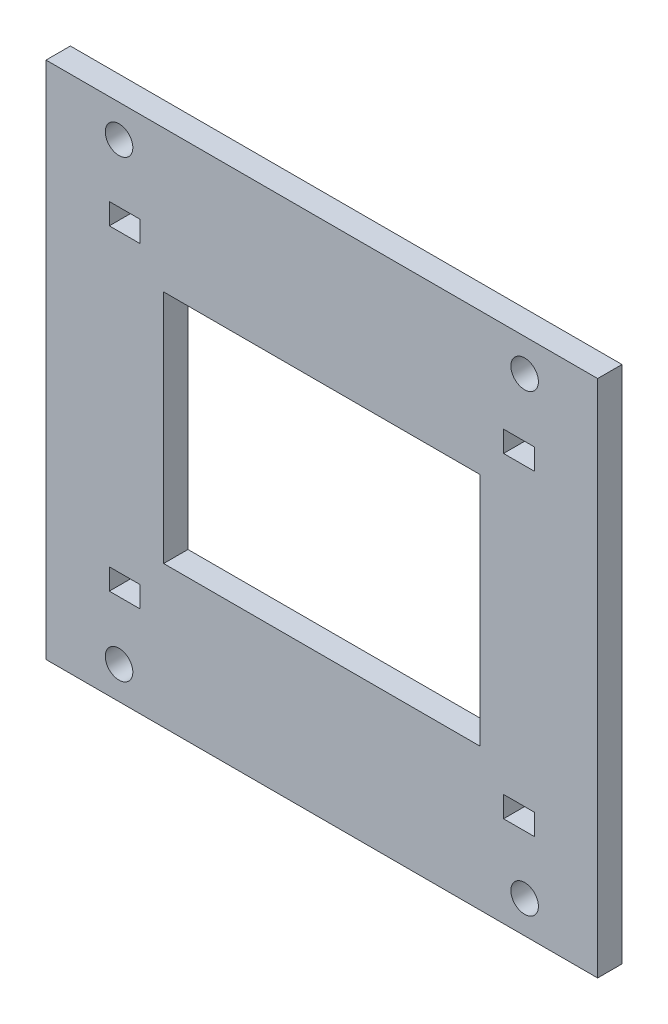
ISO-10303-21;
HEADER;
FILE_DESCRIPTION(('STEP AP214'),'2;1');
FILE_NAME('part.step','',(''),(''),'','','');
FILE_SCHEMA(('AUTOMOTIVE_DESIGN { 1 0 10303 214 1 1 1 1 }'));
ENDSEC;
DATA;
#1=APPLICATION_CONTEXT('core data for automotive mechanical design processes');
#2=APPLICATION_PROTOCOL_DEFINITION('international standard','automotive_design',2000,#1);
#3=PRODUCT_CONTEXT('',#1,'mechanical');
#4=PRODUCT('Part','Part','',(#3));
#5=PRODUCT_RELATED_PRODUCT_CATEGORY('part','',(#4));
#6=PRODUCT_DEFINITION_FORMATION('','',#4);
#7=PRODUCT_DEFINITION_CONTEXT('part definition',#1,'design');
#8=PRODUCT_DEFINITION('design','',#6,#7);
#9=PRODUCT_DEFINITION_SHAPE('','',#8);
#10=(LENGTH_UNIT() NAMED_UNIT(*) SI_UNIT(.MILLI.,.METRE.));
#11=(NAMED_UNIT(*) PLANE_ANGLE_UNIT() SI_UNIT($,.RADIAN.));
#12=(NAMED_UNIT(*) SI_UNIT($,.STERADIAN.) SOLID_ANGLE_UNIT());
#13=UNCERTAINTY_MEASURE_WITH_UNIT(LENGTH_MEASURE(1.E-05),#10,'distance_accuracy_value','');
#14=(GEOMETRIC_REPRESENTATION_CONTEXT(3) GLOBAL_UNCERTAINTY_ASSIGNED_CONTEXT((#13)) GLOBAL_UNIT_ASSIGNED_CONTEXT((#10,
#11,#12)) REPRESENTATION_CONTEXT('',''));
#15=CARTESIAN_POINT('',(0.,0.,0.));
#16=DIRECTION('',(0.,0.,1.));
#17=DIRECTION('',(1.,0.,0.));
#18=AXIS2_PLACEMENT_3D('',#15,#16,#17);
#19=CARTESIAN_POINT('',(0.,0.,3.));
#20=DIRECTION('',(0.,0.,1.));
#21=DIRECTION('',(1.,0.,0.));
#22=AXIS2_PLACEMENT_3D('',#19,#20,#21);
#23=PLANE('',#22);
#24=CARTESIAN_POINT('',(-25.,28.,3.));
#25=DIRECTION('',(0.,0.,1.));
#26=DIRECTION('',(1.,0.,0.));
#27=AXIS2_PLACEMENT_3D('',#24,#25,#26);
#28=CIRCLE('',#27,1.7);
#29=CARTESIAN_POINT('',(-23.3,28.,3.));
#30=VERTEX_POINT('',#29);
#31=EDGE_CURVE('E379',#30,#30,#28,.F.);
#32=ORIENTED_EDGE('',*,*,#31,.T.);
#33=EDGE_LOOP('',(#32));
#34=FACE_BOUND('',#33,.T.);
#35=CARTESIAN_POINT('',(25.,-28.,3.));
#36=DIRECTION('',(0.,0.,1.));
#37=DIRECTION('',(1.,0.,0.));
#38=AXIS2_PLACEMENT_3D('',#35,#36,#37);
#39=CIRCLE('',#38,1.7);
#40=CARTESIAN_POINT('',(26.7,-28.,3.));
#41=VERTEX_POINT('',#40);
#42=EDGE_CURVE('E369',#41,#41,#39,.F.);
#43=ORIENTED_EDGE('',*,*,#42,.T.);
#44=EDGE_LOOP('',(#43));
#45=FACE_BOUND('',#44,.T.);
#46=CARTESIAN_POINT('',(25.,28.,3.));
#47=DIRECTION('',(0.,0.,1.));
#48=DIRECTION('',(1.,0.,0.));
#49=AXIS2_PLACEMENT_3D('',#46,#47,#48);
#50=CIRCLE('',#49,1.7);
#51=CARTESIAN_POINT('',(26.7,28.,3.));
#52=VERTEX_POINT('',#51);
#53=EDGE_CURVE('E368',#52,#52,#50,.F.);
#54=ORIENTED_EDGE('',*,*,#53,.T.);
#55=EDGE_LOOP('',(#54));
#56=FACE_BOUND('',#55,.T.);
#57=CARTESIAN_POINT('',(-25.,-28.,3.));
#58=DIRECTION('',(0.,0.,1.));
#59=DIRECTION('',(1.,0.,0.));
#60=AXIS2_PLACEMENT_3D('',#57,#58,#59);
#61=CIRCLE('',#60,1.7);
#62=CARTESIAN_POINT('',(-23.3,-28.,3.));
#63=VERTEX_POINT('',#62);
#64=EDGE_CURVE('E361',#63,#63,#61,.F.);
#65=ORIENTED_EDGE('',*,*,#64,.T.);
#66=EDGE_LOOP('',(#65));
#67=FACE_BOUND('',#66,.T.);
#68=DIRECTION('',(0.,-1.,0.));
#69=VECTOR('',#68,1.);
#70=CARTESIAN_POINT('',(-34.,32.,3.));
#71=LINE('',#70,#69);
#72=CARTESIAN_POINT('',(-34.,32.,3.));
#73=VERTEX_POINT('',#72);
#74=CARTESIAN_POINT('',(-34.,-32.,3.));
#75=VERTEX_POINT('',#74);
#76=EDGE_CURVE('E295',#73,#75,#71,.T.);
#77=ORIENTED_EDGE('',*,*,#76,.T.);
#78=DIRECTION('',(1.,0.,0.));
#79=VECTOR('',#78,1.);
#80=CARTESIAN_POINT('',(-34.,-32.,3.));
#81=LINE('',#80,#79);
#82=CARTESIAN_POINT('',(34.,-32.,3.));
#83=VERTEX_POINT('',#82);
#84=EDGE_CURVE('E293',#75,#83,#81,.T.);
#85=ORIENTED_EDGE('',*,*,#84,.T.);
#86=DIRECTION('',(0.,1.,0.));
#87=VECTOR('',#86,1.);
#88=CARTESIAN_POINT('',(34.,-32.,3.));
#89=LINE('',#88,#87);
#90=CARTESIAN_POINT('',(34.,32.,3.));
#91=VERTEX_POINT('',#90);
#92=EDGE_CURVE('E297',#83,#91,#89,.T.);
#93=ORIENTED_EDGE('',*,*,#92,.T.);
#94=DIRECTION('',(-1.,0.,0.));
#95=VECTOR('',#94,1.);
#96=CARTESIAN_POINT('',(34.,32.,3.));
#97=LINE('',#96,#95);
#98=EDGE_CURVE('E296',#91,#73,#97,.T.);
#99=ORIENTED_EDGE('',*,*,#98,.T.);
#100=EDGE_LOOP('',(#77,#85,#93,#99));
#101=FACE_BOUND('',#100,.T.);
#102=DIRECTION('',(-1.,0.,0.));
#103=VECTOR('',#102,1.);
#104=CARTESIAN_POINT('',(0.,-14.5,3.));
#105=LINE('',#104,#103);
#106=CARTESIAN_POINT('',(19.5,-14.5,3.));
#107=VERTEX_POINT('',#106);
#108=CARTESIAN_POINT('',(-19.5,-14.5,3.));
#109=VERTEX_POINT('',#108);
#110=EDGE_CURVE('E281',#107,#109,#105,.T.);
#111=ORIENTED_EDGE('',*,*,#110,.T.);
#112=DIRECTION('',(0.,1.,0.));
#113=VECTOR('',#112,1.);
#114=CARTESIAN_POINT('',(-19.5,0.,3.));
#115=LINE('',#114,#113);
#116=CARTESIAN_POINT('',(-19.5,14.5,3.));
#117=VERTEX_POINT('',#116);
#118=EDGE_CURVE('E286',#109,#117,#115,.T.);
#119=ORIENTED_EDGE('',*,*,#118,.T.);
#120=DIRECTION('',(1.,0.,0.));
#121=VECTOR('',#120,1.);
#122=CARTESIAN_POINT('',(0.,14.5,3.));
#123=LINE('',#122,#121);
#124=CARTESIAN_POINT('',(19.5,14.5,3.));
#125=VERTEX_POINT('',#124);
#126=EDGE_CURVE('E276',#117,#125,#123,.T.);
#127=ORIENTED_EDGE('',*,*,#126,.T.);
#128=DIRECTION('',(0.,-1.,0.));
#129=VECTOR('',#128,1.);
#130=CARTESIAN_POINT('',(19.5,0.,3.));
#131=LINE('',#130,#129);
#132=EDGE_CURVE('E284',#125,#107,#131,.T.);
#133=ORIENTED_EDGE('',*,*,#132,.T.);
#134=EDGE_LOOP('',(#111,#119,#127,#133));
#135=FACE_BOUND('',#134,.T.);
#136=DIRECTION('',(-1.,0.,0.));
#137=VECTOR('',#136,1.);
#138=CARTESIAN_POINT('',(0.,-20.8,3.));
#139=LINE('',#138,#137);
#140=CARTESIAN_POINT('',(-22.4,-20.8,3.));
#141=VERTEX_POINT('',#140);
#142=CARTESIAN_POINT('',(-26.2,-20.8,3.));
#143=VERTEX_POINT('',#142);
#144=EDGE_CURVE('E229',#141,#143,#139,.T.);
#145=ORIENTED_EDGE('',*,*,#144,.T.);
#146=DIRECTION('',(0.,1.,0.));
#147=VECTOR('',#146,1.);
#148=CARTESIAN_POINT('',(-26.2,0.,3.));
#149=LINE('',#148,#147);
#150=CARTESIAN_POINT('',(-26.2,-18.2,3.));
#151=VERTEX_POINT('',#150);
#152=EDGE_CURVE('E217',#143,#151,#149,.T.);
#153=ORIENTED_EDGE('',*,*,#152,.T.);
#154=DIRECTION('',(1.,0.,0.));
#155=VECTOR('',#154,1.);
#156=CARTESIAN_POINT('',(0.,-18.2,3.));
#157=LINE('',#156,#155);
#158=CARTESIAN_POINT('',(-22.4,-18.2,3.));
#159=VERTEX_POINT('',#158);
#160=EDGE_CURVE('E203',#151,#159,#157,.T.);
#161=ORIENTED_EDGE('',*,*,#160,.T.);
#162=DIRECTION('',(0.,-1.,0.));
#163=VECTOR('',#162,1.);
#164=CARTESIAN_POINT('',(-22.4,0.,3.));
#165=LINE('',#164,#163);
#166=EDGE_CURVE('E215',#159,#141,#165,.T.);
#167=ORIENTED_EDGE('',*,*,#166,.T.);
#168=EDGE_LOOP('',(#145,#153,#161,#167));
#169=FACE_BOUND('',#168,.T.);
#170=DIRECTION('',(-1.,0.,0.));
#171=VECTOR('',#170,1.);
#172=CARTESIAN_POINT('',(0.,18.2,3.));
#173=LINE('',#172,#171);
#174=CARTESIAN_POINT('',(26.2,18.2,3.));
#175=VERTEX_POINT('',#174);
#176=CARTESIAN_POINT('',(22.4,18.2,3.));
#177=VERTEX_POINT('',#176);
#178=EDGE_CURVE('E236',#175,#177,#173,.T.);
#179=ORIENTED_EDGE('',*,*,#178,.T.);
#180=DIRECTION('',(0.,1.,0.));
#181=VECTOR('',#180,1.);
#182=CARTESIAN_POINT('',(22.4,0.,3.));
#183=LINE('',#182,#181);
#184=CARTESIAN_POINT('',(22.4,20.8,3.));
#185=VERTEX_POINT('',#184);
#186=EDGE_CURVE('E243',#177,#185,#183,.T.);
#187=ORIENTED_EDGE('',*,*,#186,.T.);
#188=DIRECTION('',(1.,0.,0.));
#189=VECTOR('',#188,1.);
#190=CARTESIAN_POINT('',(0.,20.8,3.));
#191=LINE('',#190,#189);
#192=CARTESIAN_POINT('',(26.2,20.8,3.));
#193=VERTEX_POINT('',#192);
#194=EDGE_CURVE('E227',#185,#193,#191,.T.);
#195=ORIENTED_EDGE('',*,*,#194,.T.);
#196=DIRECTION('',(0.,-1.,0.));
#197=VECTOR('',#196,1.);
#198=CARTESIAN_POINT('',(26.2,0.,3.));
#199=LINE('',#198,#197);
#200=EDGE_CURVE('E233',#193,#175,#199,.T.);
#201=ORIENTED_EDGE('',*,*,#200,.T.);
#202=EDGE_LOOP('',(#179,#187,#195,#201));
#203=FACE_BOUND('',#202,.T.);
#204=DIRECTION('',(-1.,0.,0.));
#205=VECTOR('',#204,1.);
#206=CARTESIAN_POINT('',(0.,-20.8,3.));
#207=LINE('',#206,#205);
#208=CARTESIAN_POINT('',(26.2,-20.8,3.));
#209=VERTEX_POINT('',#208);
#210=CARTESIAN_POINT('',(22.4,-20.8,3.));
#211=VERTEX_POINT('',#210);
#212=EDGE_CURVE('E249',#209,#211,#207,.T.);
#213=ORIENTED_EDGE('',*,*,#212,.T.);
#214=DIRECTION('',(0.,1.,0.));
#215=VECTOR('',#214,1.);
#216=CARTESIAN_POINT('',(22.4,0.,3.));
#217=LINE('',#216,#215);
#218=CARTESIAN_POINT('',(22.4,-18.2,3.));
#219=VERTEX_POINT('',#218);
#220=EDGE_CURVE('E251',#211,#219,#217,.T.);
#221=ORIENTED_EDGE('',*,*,#220,.T.);
#222=DIRECTION('',(1.,0.,0.));
#223=VECTOR('',#222,1.);
#224=CARTESIAN_POINT('',(0.,-18.2,3.));
#225=LINE('',#224,#223);
#226=CARTESIAN_POINT('',(26.2,-18.2,3.));
#227=VERTEX_POINT('',#226);
#228=EDGE_CURVE('E245',#219,#227,#225,.T.);
#229=ORIENTED_EDGE('',*,*,#228,.T.);
#230=DIRECTION('',(0.,-1.,0.));
#231=VECTOR('',#230,1.);
#232=CARTESIAN_POINT('',(26.2,0.,3.));
#233=LINE('',#232,#231);
#234=EDGE_CURVE('E250',#227,#209,#233,.T.);
#235=ORIENTED_EDGE('',*,*,#234,.T.);
#236=EDGE_LOOP('',(#213,#221,#229,#235));
#237=FACE_BOUND('',#236,.T.);
#238=DIRECTION('',(-1.,0.,0.));
#239=VECTOR('',#238,1.);
#240=CARTESIAN_POINT('',(0.,18.2,3.));
#241=LINE('',#240,#239);
#242=CARTESIAN_POINT('',(-22.4,18.2,3.));
#243=VERTEX_POINT('',#242);
#244=CARTESIAN_POINT('',(-26.2,18.2,3.));
#245=VERTEX_POINT('',#244);
#246=EDGE_CURVE('E265',#243,#245,#241,.T.);
#247=ORIENTED_EDGE('',*,*,#246,.T.);
#248=DIRECTION('',(0.,1.,0.));
#249=VECTOR('',#248,1.);
#250=CARTESIAN_POINT('',(-26.2,0.,3.));
#251=LINE('',#250,#249);
#252=CARTESIAN_POINT('',(-26.2,20.8,3.));
#253=VERTEX_POINT('',#252);
#254=EDGE_CURVE('E264',#245,#253,#251,.T.);
#255=ORIENTED_EDGE('',*,*,#254,.T.);
#256=DIRECTION('',(1.,0.,0.));
#257=VECTOR('',#256,1.);
#258=CARTESIAN_POINT('',(0.,20.8,3.));
#259=LINE('',#258,#257);
#260=CARTESIAN_POINT('',(-22.4,20.8,3.));
#261=VERTEX_POINT('',#260);
#262=EDGE_CURVE('E258',#253,#261,#259,.T.);
#263=ORIENTED_EDGE('',*,*,#262,.T.);
#264=DIRECTION('',(0.,-1.,0.));
#265=VECTOR('',#264,1.);
#266=CARTESIAN_POINT('',(-22.4,0.,3.));
#267=LINE('',#266,#265);
#268=EDGE_CURVE('E259',#261,#243,#267,.T.);
#269=ORIENTED_EDGE('',*,*,#268,.T.);
#270=EDGE_LOOP('',(#247,#255,#263,#269));
#271=FACE_BOUND('',#270,.T.);
#272=ADVANCED_FACE('F39',(#34,#45,#56,#67,#101,#135,#169,#203,#237,#271),#23,.T.);
#273=CARTESIAN_POINT('',(0.,0.,0.));
#274=DIRECTION('',(0.,0.,1.));
#275=DIRECTION('',(1.,0.,0.));
#276=AXIS2_PLACEMENT_3D('',#273,#274,#275);
#277=PLANE('',#276);
#278=CARTESIAN_POINT('',(-25.,28.,0.));
#279=DIRECTION('',(0.,0.,1.));
#280=DIRECTION('',(1.,0.,0.));
#281=AXIS2_PLACEMENT_3D('',#278,#279,#280);
#282=CIRCLE('',#281,1.7);
#283=CARTESIAN_POINT('',(-23.3,28.,0.));
#284=VERTEX_POINT('',#283);
#285=EDGE_CURVE('E43',#284,#284,#282,.F.);
#286=ORIENTED_EDGE('',*,*,#285,.F.);
#287=EDGE_LOOP('',(#286));
#288=FACE_BOUND('',#287,.T.);
#289=CARTESIAN_POINT('',(25.,-28.,0.));
#290=DIRECTION('',(0.,0.,1.));
#291=DIRECTION('',(1.,0.,0.));
#292=AXIS2_PLACEMENT_3D('',#289,#290,#291);
#293=CIRCLE('',#292,1.7);
#294=CARTESIAN_POINT('',(26.7,-28.,0.));
#295=VERTEX_POINT('',#294);
#296=EDGE_CURVE('E370',#295,#295,#293,.F.);
#297=ORIENTED_EDGE('',*,*,#296,.F.);
#298=EDGE_LOOP('',(#297));
#299=FACE_BOUND('',#298,.T.);
#300=CARTESIAN_POINT('',(25.,28.,0.));
#301=DIRECTION('',(0.,0.,1.));
#302=DIRECTION('',(1.,0.,0.));
#303=AXIS2_PLACEMENT_3D('',#300,#301,#302);
#304=CIRCLE('',#303,1.7);
#305=CARTESIAN_POINT('',(26.7,28.,0.));
#306=VERTEX_POINT('',#305);
#307=EDGE_CURVE('E365',#306,#306,#304,.F.);
#308=ORIENTED_EDGE('',*,*,#307,.F.);
#309=EDGE_LOOP('',(#308));
#310=FACE_BOUND('',#309,.T.);
#311=CARTESIAN_POINT('',(-25.,-28.,0.));
#312=DIRECTION('',(0.,0.,1.));
#313=DIRECTION('',(1.,0.,0.));
#314=AXIS2_PLACEMENT_3D('',#311,#312,#313);
#315=CIRCLE('',#314,1.7);
#316=CARTESIAN_POINT('',(-23.3,-28.,0.));
#317=VERTEX_POINT('',#316);
#318=EDGE_CURVE('E359',#317,#317,#315,.F.);
#319=ORIENTED_EDGE('',*,*,#318,.F.);
#320=EDGE_LOOP('',(#319));
#321=FACE_BOUND('',#320,.T.);
#322=DIRECTION('',(0.,1.,0.));
#323=VECTOR('',#322,1.);
#324=CARTESIAN_POINT('',(22.4,0.,0.));
#325=LINE('',#324,#323);
#326=CARTESIAN_POINT('',(22.4,-20.8,0.));
#327=VERTEX_POINT('',#326);
#328=CARTESIAN_POINT('',(22.4,-18.2,0.));
#329=VERTEX_POINT('',#328);
#330=EDGE_CURVE('E354',#327,#329,#325,.T.);
#331=ORIENTED_EDGE('',*,*,#330,.F.);
#332=DIRECTION('',(-1.,0.,0.));
#333=VECTOR('',#332,1.);
#334=CARTESIAN_POINT('',(0.,-20.8,0.));
#335=LINE('',#334,#333);
#336=CARTESIAN_POINT('',(26.2,-20.8,0.));
#337=VERTEX_POINT('',#336);
#338=EDGE_CURVE('E348',#337,#327,#335,.T.);
#339=ORIENTED_EDGE('',*,*,#338,.F.);
#340=DIRECTION('',(0.,-1.,0.));
#341=VECTOR('',#340,1.);
#342=CARTESIAN_POINT('',(26.2,0.,0.));
#343=LINE('',#342,#341);
#344=CARTESIAN_POINT('',(26.2,-18.2,0.));
#345=VERTEX_POINT('',#344);
#346=EDGE_CURVE('E346',#345,#337,#343,.T.);
#347=ORIENTED_EDGE('',*,*,#346,.F.);
#348=DIRECTION('',(1.,0.,0.));
#349=VECTOR('',#348,1.);
#350=CARTESIAN_POINT('',(0.,-18.2,0.));
#351=LINE('',#350,#349);
#352=EDGE_CURVE('E347',#329,#345,#351,.T.);
#353=ORIENTED_EDGE('',*,*,#352,.F.);
#354=EDGE_LOOP('',(#331,#339,#347,#353));
#355=FACE_BOUND('',#354,.T.);
#356=DIRECTION('',(0.,1.,0.));
#357=VECTOR('',#356,1.);
#358=CARTESIAN_POINT('',(-26.2,0.,0.));
#359=LINE('',#358,#357);
#360=CARTESIAN_POINT('',(-26.2,-20.8,0.));
#361=VERTEX_POINT('',#360);
#362=CARTESIAN_POINT('',(-26.2,-18.2,0.));
#363=VERTEX_POINT('',#362);
#364=EDGE_CURVE('E222',#361,#363,#359,.T.);
#365=ORIENTED_EDGE('',*,*,#364,.F.);
#366=DIRECTION('',(-1.,0.,0.));
#367=VECTOR('',#366,1.);
#368=CARTESIAN_POINT('',(0.,-20.8,0.));
#369=LINE('',#368,#367);
#370=CARTESIAN_POINT('',(-22.4,-20.8,0.));
#371=VERTEX_POINT('',#370);
#372=EDGE_CURVE('E331',#371,#361,#369,.T.);
#373=ORIENTED_EDGE('',*,*,#372,.F.);
#374=DIRECTION('',(0.,-1.,0.));
#375=VECTOR('',#374,1.);
#376=CARTESIAN_POINT('',(-22.4,0.,0.));
#377=LINE('',#376,#375);
#378=CARTESIAN_POINT('',(-22.4,-18.2,0.));
#379=VERTEX_POINT('',#378);
#380=EDGE_CURVE('E335',#379,#371,#377,.T.);
#381=ORIENTED_EDGE('',*,*,#380,.F.);
#382=DIRECTION('',(1.,0.,0.));
#383=VECTOR('',#382,1.);
#384=CARTESIAN_POINT('',(0.,-18.2,0.));
#385=LINE('',#384,#383);
#386=EDGE_CURVE('E329',#363,#379,#385,.T.);
#387=ORIENTED_EDGE('',*,*,#386,.F.);
#388=EDGE_LOOP('',(#365,#373,#381,#387));
#389=FACE_BOUND('',#388,.T.);
#390=DIRECTION('',(0.,-1.,0.));
#391=VECTOR('',#390,1.);
#392=CARTESIAN_POINT('',(-34.,32.,0.));
#393=LINE('',#392,#391);
#394=CARTESIAN_POINT('',(-34.,32.,0.));
#395=VERTEX_POINT('',#394);
#396=CARTESIAN_POINT('',(-34.,-32.,0.));
#397=VERTEX_POINT('',#396);
#398=EDGE_CURVE('E292',#395,#397,#393,.T.);
#399=ORIENTED_EDGE('',*,*,#398,.F.);
#400=DIRECTION('',(-1.,0.,0.));
#401=VECTOR('',#400,1.);
#402=CARTESIAN_POINT('',(34.,32.,0.));
#403=LINE('',#402,#401);
#404=CARTESIAN_POINT('',(34.,32.,0.));
#405=VERTEX_POINT('',#404);
#406=EDGE_CURVE('E298',#405,#395,#403,.T.);
#407=ORIENTED_EDGE('',*,*,#406,.F.);
#408=DIRECTION('',(0.,1.,0.));
#409=VECTOR('',#408,1.);
#410=CARTESIAN_POINT('',(34.,-32.,0.));
#411=LINE('',#410,#409);
#412=CARTESIAN_POINT('',(34.,-32.,0.));
#413=VERTEX_POINT('',#412);
#414=EDGE_CURVE('E307',#413,#405,#411,.T.);
#415=ORIENTED_EDGE('',*,*,#414,.F.);
#416=DIRECTION('',(1.,0.,0.));
#417=VECTOR('',#416,1.);
#418=CARTESIAN_POINT('',(-34.,-32.,0.));
#419=LINE('',#418,#417);
#420=EDGE_CURVE('E304',#397,#413,#419,.T.);
#421=ORIENTED_EDGE('',*,*,#420,.F.);
#422=EDGE_LOOP('',(#399,#407,#415,#421));
#423=FACE_BOUND('',#422,.T.);
#424=DIRECTION('',(0.,1.,0.));
#425=VECTOR('',#424,1.);
#426=CARTESIAN_POINT('',(-19.5,0.,0.));
#427=LINE('',#426,#425);
#428=CARTESIAN_POINT('',(-19.5,-14.5,0.));
#429=VERTEX_POINT('',#428);
#430=CARTESIAN_POINT('',(-19.5,14.5,0.));
#431=VERTEX_POINT('',#430);
#432=EDGE_CURVE('E330',#429,#431,#427,.T.);
#433=ORIENTED_EDGE('',*,*,#432,.F.);
#434=DIRECTION('',(-1.,0.,0.));
#435=VECTOR('',#434,1.);
#436=CARTESIAN_POINT('',(0.,-14.5,0.));
#437=LINE('',#436,#435);
#438=CARTESIAN_POINT('',(19.5,-14.5,0.));
#439=VERTEX_POINT('',#438);
#440=EDGE_CURVE('E324',#439,#429,#437,.T.);
#441=ORIENTED_EDGE('',*,*,#440,.F.);
#442=DIRECTION('',(0.,-1.,0.));
#443=VECTOR('',#442,1.);
#444=CARTESIAN_POINT('',(19.5,0.,0.));
#445=LINE('',#444,#443);
#446=CARTESIAN_POINT('',(19.5,14.5,0.));
#447=VERTEX_POINT('',#446);
#448=EDGE_CURVE('E323',#447,#439,#445,.T.);
#449=ORIENTED_EDGE('',*,*,#448,.F.);
#450=DIRECTION('',(1.,0.,0.));
#451=VECTOR('',#450,1.);
#452=CARTESIAN_POINT('',(0.,14.5,0.));
#453=LINE('',#452,#451);
#454=EDGE_CURVE('E321',#431,#447,#453,.T.);
#455=ORIENTED_EDGE('',*,*,#454,.F.);
#456=EDGE_LOOP('',(#433,#441,#449,#455));
#457=FACE_BOUND('',#456,.T.);
#458=DIRECTION('',(0.,1.,0.));
#459=VECTOR('',#458,1.);
#460=CARTESIAN_POINT('',(22.4,0.,0.));
#461=LINE('',#460,#459);
#462=CARTESIAN_POINT('',(22.4,18.2,0.));
#463=VERTEX_POINT('',#462);
#464=CARTESIAN_POINT('',(22.4,20.8,0.));
#465=VERTEX_POINT('',#464);
#466=EDGE_CURVE('E341',#463,#465,#461,.T.);
#467=ORIENTED_EDGE('',*,*,#466,.F.);
#468=DIRECTION('',(-1.,0.,0.));
#469=VECTOR('',#468,1.);
#470=CARTESIAN_POINT('',(0.,18.2,0.));
#471=LINE('',#470,#469);
#472=CARTESIAN_POINT('',(26.2,18.2,0.));
#473=VERTEX_POINT('',#472);
#474=EDGE_CURVE('E343',#473,#463,#471,.T.);
#475=ORIENTED_EDGE('',*,*,#474,.F.);
#476=DIRECTION('',(0.,-1.,0.));
#477=VECTOR('',#476,1.);
#478=CARTESIAN_POINT('',(26.2,0.,0.));
#479=LINE('',#478,#477);
#480=CARTESIAN_POINT('',(26.2,20.8,0.));
#481=VERTEX_POINT('',#480);
#482=EDGE_CURVE('E340',#481,#473,#479,.T.);
#483=ORIENTED_EDGE('',*,*,#482,.F.);
#484=DIRECTION('',(1.,0.,0.));
#485=VECTOR('',#484,1.);
#486=CARTESIAN_POINT('',(0.,20.8,0.));
#487=LINE('',#486,#485);
#488=EDGE_CURVE('E339',#465,#481,#487,.T.);
#489=ORIENTED_EDGE('',*,*,#488,.F.);
#490=EDGE_LOOP('',(#467,#475,#483,#489));
#491=FACE_BOUND('',#490,.T.);
#492=DIRECTION('',(0.,1.,0.));
#493=VECTOR('',#492,1.);
#494=CARTESIAN_POINT('',(-26.2,0.,0.));
#495=LINE('',#494,#493);
#496=CARTESIAN_POINT('',(-26.2,18.2,0.));
#497=VERTEX_POINT('',#496);
#498=CARTESIAN_POINT('',(-26.2,20.8,0.));
#499=VERTEX_POINT('',#498);
#500=EDGE_CURVE('E11',#497,#499,#495,.T.);
#501=ORIENTED_EDGE('',*,*,#500,.F.);
#502=DIRECTION('',(-1.,0.,0.));
#503=VECTOR('',#502,1.);
#504=CARTESIAN_POINT('',(0.,18.2,0.));
#505=LINE('',#504,#503);
#506=CARTESIAN_POINT('',(-22.4,18.2,0.));
#507=VERTEX_POINT('',#506);
#508=EDGE_CURVE('E48',#507,#497,#505,.T.);
#509=ORIENTED_EDGE('',*,*,#508,.F.);
#510=DIRECTION('',(0.,-1.,0.));
#511=VECTOR('',#510,1.);
#512=CARTESIAN_POINT('',(-22.4,0.,0.));
#513=LINE('',#512,#511);
#514=CARTESIAN_POINT('',(-22.4,20.8,0.));
#515=VERTEX_POINT('',#514);
#516=EDGE_CURVE('E360',#515,#507,#513,.T.);
#517=ORIENTED_EDGE('',*,*,#516,.F.);
#518=DIRECTION('',(1.,0.,0.));
#519=VECTOR('',#518,1.);
#520=CARTESIAN_POINT('',(0.,20.8,0.));
#521=LINE('',#520,#519);
#522=EDGE_CURVE('E351',#499,#515,#521,.T.);
#523=ORIENTED_EDGE('',*,*,#522,.F.);
#524=EDGE_LOOP('',(#501,#509,#517,#523));
#525=FACE_BOUND('',#524,.T.);
#526=ADVANCED_FACE('F421',(#288,#299,#310,#321,#355,#389,#423,#457,#491,#525),#277,.F.);
#527=CARTESIAN_POINT('',(-34.,32.,3.));
#528=DIRECTION('',(1.,0.,0.));
#529=DIRECTION('',(0.,0.,-1.));
#530=AXIS2_PLACEMENT_3D('',#527,#528,#529);
#531=PLANE('',#530);
#532=ORIENTED_EDGE('',*,*,#398,.T.);
#533=DIRECTION('',(0.,0.,-1.));
#534=VECTOR('',#533,1.);
#535=CARTESIAN_POINT('',(-34.,-32.,3.));
#536=LINE('',#535,#534);
#537=EDGE_CURVE('E318',#75,#397,#536,.T.);
#538=ORIENTED_EDGE('',*,*,#537,.F.);
#539=ORIENTED_EDGE('',*,*,#76,.F.);
#540=DIRECTION('',(0.,0.,-1.));
#541=VECTOR('',#540,1.);
#542=CARTESIAN_POINT('',(-34.,32.,3.));
#543=LINE('',#542,#541);
#544=EDGE_CURVE('E305',#73,#395,#543,.T.);
#545=ORIENTED_EDGE('',*,*,#544,.T.);
#546=EDGE_LOOP('',(#532,#538,#539,#545));
#547=FACE_BOUND('',#546,.T.);
#548=ADVANCED_FACE('F41',(#547),#531,.F.);
#549=CARTESIAN_POINT('',(-34.,-32.,3.));
#550=DIRECTION('',(0.,1.,0.));
#551=DIRECTION('',(0.,0.,1.));
#552=AXIS2_PLACEMENT_3D('',#549,#550,#551);
#553=PLANE('',#552);
#554=ORIENTED_EDGE('',*,*,#420,.T.);
#555=DIRECTION('',(0.,0.,-1.));
#556=VECTOR('',#555,1.);
#557=CARTESIAN_POINT('',(34.,-32.,3.));
#558=LINE('',#557,#556);
#559=EDGE_CURVE('E312',#83,#413,#558,.T.);
#560=ORIENTED_EDGE('',*,*,#559,.F.);
#561=ORIENTED_EDGE('',*,*,#84,.F.);
#562=ORIENTED_EDGE('',*,*,#537,.T.);
#563=EDGE_LOOP('',(#554,#560,#561,#562));
#564=FACE_BOUND('',#563,.T.);
#565=ADVANCED_FACE('F479',(#564),#553,.F.);
#566=CARTESIAN_POINT('',(34.,-32.,3.));
#567=DIRECTION('',(-1.,0.,0.));
#568=DIRECTION('',(0.,0.,1.));
#569=AXIS2_PLACEMENT_3D('',#566,#567,#568);
#570=PLANE('',#569);
#571=ORIENTED_EDGE('',*,*,#414,.T.);
#572=DIRECTION('',(0.,0.,-1.));
#573=VECTOR('',#572,1.);
#574=CARTESIAN_POINT('',(34.,32.,3.));
#575=LINE('',#574,#573);
#576=EDGE_CURVE('E315',#91,#405,#575,.T.);
#577=ORIENTED_EDGE('',*,*,#576,.F.);
#578=ORIENTED_EDGE('',*,*,#92,.F.);
#579=ORIENTED_EDGE('',*,*,#559,.T.);
#580=EDGE_LOOP('',(#571,#577,#578,#579));
#581=FACE_BOUND('',#580,.T.);
#582=ADVANCED_FACE('F478',(#581),#570,.F.);
#583=CARTESIAN_POINT('',(34.,32.,3.));
#584=DIRECTION('',(0.,-1.,0.));
#585=DIRECTION('',(0.,0.,-1.));
#586=AXIS2_PLACEMENT_3D('',#583,#584,#585);
#587=PLANE('',#586);
#588=ORIENTED_EDGE('',*,*,#406,.T.);
#589=ORIENTED_EDGE('',*,*,#544,.F.);
#590=ORIENTED_EDGE('',*,*,#98,.F.);
#591=ORIENTED_EDGE('',*,*,#576,.T.);
#592=EDGE_LOOP('',(#588,#589,#590,#591));
#593=FACE_BOUND('',#592,.T.);
#594=ADVANCED_FACE('F471',(#593),#587,.F.);
#595=CARTESIAN_POINT('',(-19.5,14.5,3.1));
#596=DIRECTION('',(1.,0.,0.));
#597=DIRECTION('',(0.,0.,-1.));
#598=AXIS2_PLACEMENT_3D('',#595,#596,#597);
#599=PLANE('',#598);
#600=DIRECTION('',(0.,0.,-1.));
#601=VECTOR('',#600,1.);
#602=CARTESIAN_POINT('',(-19.5,-14.5,3.1));
#603=LINE('',#602,#601);
#604=EDGE_CURVE('E277',#109,#429,#603,.T.);
#605=ORIENTED_EDGE('',*,*,#604,.T.);
#606=ORIENTED_EDGE('',*,*,#432,.T.);
#607=DIRECTION('',(0.,0.,-1.));
#608=VECTOR('',#607,1.);
#609=CARTESIAN_POINT('',(-19.5,14.5,3.1));
#610=LINE('',#609,#608);
#611=EDGE_CURVE('E268',#117,#431,#610,.T.);
#612=ORIENTED_EDGE('',*,*,#611,.F.);
#613=ORIENTED_EDGE('',*,*,#118,.F.);
#614=EDGE_LOOP('',(#605,#606,#612,#613));
#615=FACE_BOUND('',#614,.T.);
#616=ADVANCED_FACE('F469',(#615),#599,.T.);
#617=CARTESIAN_POINT('',(-19.5,-14.5,3.1));
#618=DIRECTION('',(0.,1.,0.));
#619=DIRECTION('',(0.,0.,1.));
#620=AXIS2_PLACEMENT_3D('',#617,#618,#619);
#621=PLANE('',#620);
#622=DIRECTION('',(0.,0.,-1.));
#623=VECTOR('',#622,1.);
#624=CARTESIAN_POINT('',(19.5,-14.5,3.1));
#625=LINE('',#624,#623);
#626=EDGE_CURVE('E272',#107,#439,#625,.T.);
#627=ORIENTED_EDGE('',*,*,#626,.T.);
#628=ORIENTED_EDGE('',*,*,#440,.T.);
#629=ORIENTED_EDGE('',*,*,#604,.F.);
#630=ORIENTED_EDGE('',*,*,#110,.F.);
#631=EDGE_LOOP('',(#627,#628,#629,#630));
#632=FACE_BOUND('',#631,.T.);
#633=ADVANCED_FACE('F503',(#632),#621,.T.);
#634=CARTESIAN_POINT('',(19.5,-14.5,3.1));
#635=DIRECTION('',(-1.,0.,0.));
#636=DIRECTION('',(0.,0.,1.));
#637=AXIS2_PLACEMENT_3D('',#634,#635,#636);
#638=PLANE('',#637);
#639=DIRECTION('',(0.,0.,-1.));
#640=VECTOR('',#639,1.);
#641=CARTESIAN_POINT('',(19.5,14.5,3.1));
#642=LINE('',#641,#640);
#643=EDGE_CURVE('E269',#125,#447,#642,.T.);
#644=ORIENTED_EDGE('',*,*,#643,.T.);
#645=ORIENTED_EDGE('',*,*,#448,.T.);
#646=ORIENTED_EDGE('',*,*,#626,.F.);
#647=ORIENTED_EDGE('',*,*,#132,.F.);
#648=EDGE_LOOP('',(#644,#645,#646,#647));
#649=FACE_BOUND('',#648,.T.);
#650=ADVANCED_FACE('F502',(#649),#638,.T.);
#651=CARTESIAN_POINT('',(19.5,14.5,3.1));
#652=DIRECTION('',(0.,-1.,0.));
#653=DIRECTION('',(0.,0.,-1.));
#654=AXIS2_PLACEMENT_3D('',#651,#652,#653);
#655=PLANE('',#654);
#656=ORIENTED_EDGE('',*,*,#611,.T.);
#657=ORIENTED_EDGE('',*,*,#454,.T.);
#658=ORIENTED_EDGE('',*,*,#643,.F.);
#659=ORIENTED_EDGE('',*,*,#126,.F.);
#660=EDGE_LOOP('',(#656,#657,#658,#659));
#661=FACE_BOUND('',#660,.T.);
#662=ADVANCED_FACE('F506',(#661),#655,.T.);
#663=CARTESIAN_POINT('',(-26.2,-18.2,3.1));
#664=DIRECTION('',(1.,0.,0.));
#665=DIRECTION('',(0.,0.,-1.));
#666=AXIS2_PLACEMENT_3D('',#663,#664,#665);
#667=PLANE('',#666);
#668=DIRECTION('',(0.,0.,-1.));
#669=VECTOR('',#668,1.);
#670=CARTESIAN_POINT('',(-26.2,-20.8,3.1));
#671=LINE('',#670,#669);
#672=EDGE_CURVE('E213',#143,#361,#671,.T.);
#673=ORIENTED_EDGE('',*,*,#672,.T.);
#674=ORIENTED_EDGE('',*,*,#364,.T.);
#675=DIRECTION('',(0.,0.,-1.));
#676=VECTOR('',#675,1.);
#677=CARTESIAN_POINT('',(-26.2,-18.2,3.1));
#678=LINE('',#677,#676);
#679=EDGE_CURVE('E204',#151,#363,#678,.T.);
#680=ORIENTED_EDGE('',*,*,#679,.F.);
#681=ORIENTED_EDGE('',*,*,#152,.F.);
#682=EDGE_LOOP('',(#673,#674,#680,#681));
#683=FACE_BOUND('',#682,.T.);
#684=ADVANCED_FACE('F220',(#683),#667,.T.);
#685=CARTESIAN_POINT('',(-26.2,-20.8,3.1));
#686=DIRECTION('',(0.,1.,0.));
#687=DIRECTION('',(0.,0.,1.));
#688=AXIS2_PLACEMENT_3D('',#685,#686,#687);
#689=PLANE('',#688);
#690=DIRECTION('',(0.,0.,-1.));
#691=VECTOR('',#690,1.);
#692=CARTESIAN_POINT('',(-22.4,-20.8,3.1));
#693=LINE('',#692,#691);
#694=EDGE_CURVE('E415',#141,#371,#693,.T.);
#695=ORIENTED_EDGE('',*,*,#694,.T.);
#696=ORIENTED_EDGE('',*,*,#372,.T.);
#697=ORIENTED_EDGE('',*,*,#672,.F.);
#698=ORIENTED_EDGE('',*,*,#144,.F.);
#699=EDGE_LOOP('',(#695,#696,#697,#698));
#700=FACE_BOUND('',#699,.T.);
#701=ADVANCED_FACE('F423',(#700),#689,.T.);
#702=CARTESIAN_POINT('',(-22.4,-20.8,3.1));
#703=DIRECTION('',(-1.,0.,0.));
#704=DIRECTION('',(0.,0.,1.));
#705=AXIS2_PLACEMENT_3D('',#702,#703,#704);
#706=PLANE('',#705);
#707=DIRECTION('',(0.,0.,-1.));
#708=VECTOR('',#707,1.);
#709=CARTESIAN_POINT('',(-22.4,-18.2,3.1));
#710=LINE('',#709,#708);
#711=EDGE_CURVE('E210',#159,#379,#710,.T.);
#712=ORIENTED_EDGE('',*,*,#711,.T.);
#713=ORIENTED_EDGE('',*,*,#380,.T.);
#714=ORIENTED_EDGE('',*,*,#694,.F.);
#715=ORIENTED_EDGE('',*,*,#166,.F.);
#716=EDGE_LOOP('',(#712,#713,#714,#715));
#717=FACE_BOUND('',#716,.T.);
#718=ADVANCED_FACE('F417',(#717),#706,.T.);
#719=CARTESIAN_POINT('',(-22.4,-18.2,3.1));
#720=DIRECTION('',(0.,-1.,0.));
#721=DIRECTION('',(0.,0.,-1.));
#722=AXIS2_PLACEMENT_3D('',#719,#720,#721);
#723=PLANE('',#722);
#724=ORIENTED_EDGE('',*,*,#679,.T.);
#725=ORIENTED_EDGE('',*,*,#386,.T.);
#726=ORIENTED_EDGE('',*,*,#711,.F.);
#727=ORIENTED_EDGE('',*,*,#160,.F.);
#728=EDGE_LOOP('',(#724,#725,#726,#727));
#729=FACE_BOUND('',#728,.T.);
#730=ADVANCED_FACE('F201',(#729),#723,.T.);
#731=CARTESIAN_POINT('',(22.4,20.8,3.1));
#732=DIRECTION('',(1.,0.,0.));
#733=DIRECTION('',(0.,0.,-1.));
#734=AXIS2_PLACEMENT_3D('',#731,#732,#733);
#735=PLANE('',#734);
#736=DIRECTION('',(0.,0.,-1.));
#737=VECTOR('',#736,1.);
#738=CARTESIAN_POINT('',(22.4,18.2,3.1));
#739=LINE('',#738,#737);
#740=EDGE_CURVE('E382',#177,#463,#739,.T.);
#741=ORIENTED_EDGE('',*,*,#740,.T.);
#742=ORIENTED_EDGE('',*,*,#466,.T.);
#743=DIRECTION('',(0.,0.,-1.));
#744=VECTOR('',#743,1.);
#745=CARTESIAN_POINT('',(22.4,20.8,3.1));
#746=LINE('',#745,#744);
#747=EDGE_CURVE('E394',#185,#465,#746,.T.);
#748=ORIENTED_EDGE('',*,*,#747,.F.);
#749=ORIENTED_EDGE('',*,*,#186,.F.);
#750=EDGE_LOOP('',(#741,#742,#748,#749));
#751=FACE_BOUND('',#750,.T.);
#752=ADVANCED_FACE('F600',(#751),#735,.T.);
#753=CARTESIAN_POINT('',(22.4,18.2,3.1));
#754=DIRECTION('',(0.,1.,0.));
#755=DIRECTION('',(0.,0.,1.));
#756=AXIS2_PLACEMENT_3D('',#753,#754,#755);
#757=PLANE('',#756);
#758=DIRECTION('',(0.,0.,-1.));
#759=VECTOR('',#758,1.);
#760=CARTESIAN_POINT('',(26.2,18.2,3.1));
#761=LINE('',#760,#759);
#762=EDGE_CURVE('E387',#175,#473,#761,.T.);
#763=ORIENTED_EDGE('',*,*,#762,.T.);
#764=ORIENTED_EDGE('',*,*,#474,.T.);
#765=ORIENTED_EDGE('',*,*,#740,.F.);
#766=ORIENTED_EDGE('',*,*,#178,.F.);
#767=EDGE_LOOP('',(#763,#764,#765,#766));
#768=FACE_BOUND('',#767,.T.);
#769=ADVANCED_FACE('F604',(#768),#757,.T.);
#770=CARTESIAN_POINT('',(26.2,18.2,3.1));
#771=DIRECTION('',(-1.,0.,0.));
#772=DIRECTION('',(0.,0.,1.));
#773=AXIS2_PLACEMENT_3D('',#770,#771,#772);
#774=PLANE('',#773);
#775=DIRECTION('',(0.,0.,-1.));
#776=VECTOR('',#775,1.);
#777=CARTESIAN_POINT('',(26.2,20.8,3.1));
#778=LINE('',#777,#776);
#779=EDGE_CURVE('E386',#193,#481,#778,.T.);
#780=ORIENTED_EDGE('',*,*,#779,.T.);
#781=ORIENTED_EDGE('',*,*,#482,.T.);
#782=ORIENTED_EDGE('',*,*,#762,.F.);
#783=ORIENTED_EDGE('',*,*,#200,.F.);
#784=EDGE_LOOP('',(#780,#781,#782,#783));
#785=FACE_BOUND('',#784,.T.);
#786=ADVANCED_FACE('F615',(#785),#774,.T.);
#787=CARTESIAN_POINT('',(26.2,20.8,3.1));
#788=DIRECTION('',(0.,-1.,0.));
#789=DIRECTION('',(0.,0.,-1.));
#790=AXIS2_PLACEMENT_3D('',#787,#788,#789);
#791=PLANE('',#790);
#792=ORIENTED_EDGE('',*,*,#747,.T.);
#793=ORIENTED_EDGE('',*,*,#488,.T.);
#794=ORIENTED_EDGE('',*,*,#779,.F.);
#795=ORIENTED_EDGE('',*,*,#194,.F.);
#796=EDGE_LOOP('',(#792,#793,#794,#795));
#797=FACE_BOUND('',#796,.T.);
#798=ADVANCED_FACE('F621',(#797),#791,.T.);
#799=CARTESIAN_POINT('',(22.4,-18.2,3.1));
#800=DIRECTION('',(1.,0.,0.));
#801=DIRECTION('',(0.,0.,-1.));
#802=AXIS2_PLACEMENT_3D('',#799,#800,#801);
#803=PLANE('',#802);
#804=DIRECTION('',(0.,0.,-1.));
#805=VECTOR('',#804,1.);
#806=CARTESIAN_POINT('',(22.4,-20.8,3.1));
#807=LINE('',#806,#805);
#808=EDGE_CURVE('E395',#211,#327,#807,.T.);
#809=ORIENTED_EDGE('',*,*,#808,.T.);
#810=ORIENTED_EDGE('',*,*,#330,.T.);
#811=DIRECTION('',(0.,0.,-1.));
#812=VECTOR('',#811,1.);
#813=CARTESIAN_POINT('',(22.4,-18.2,3.1));
#814=LINE('',#813,#812);
#815=EDGE_CURVE('E397',#219,#329,#814,.T.);
#816=ORIENTED_EDGE('',*,*,#815,.F.);
#817=ORIENTED_EDGE('',*,*,#220,.F.);
#818=EDGE_LOOP('',(#809,#810,#816,#817));
#819=FACE_BOUND('',#818,.T.);
#820=ADVANCED_FACE('F635',(#819),#803,.T.);
#821=CARTESIAN_POINT('',(22.4,-20.8,3.1));
#822=DIRECTION('',(0.,1.,0.));
#823=DIRECTION('',(0.,0.,1.));
#824=AXIS2_PLACEMENT_3D('',#821,#822,#823);
#825=PLANE('',#824);
#826=DIRECTION('',(0.,0.,-1.));
#827=VECTOR('',#826,1.);
#828=CARTESIAN_POINT('',(26.2,-20.8,3.1));
#829=LINE('',#828,#827);
#830=EDGE_CURVE('E408',#209,#337,#829,.T.);
#831=ORIENTED_EDGE('',*,*,#830,.T.);
#832=ORIENTED_EDGE('',*,*,#338,.T.);
#833=ORIENTED_EDGE('',*,*,#808,.F.);
#834=ORIENTED_EDGE('',*,*,#212,.F.);
#835=EDGE_LOOP('',(#831,#832,#833,#834));
#836=FACE_BOUND('',#835,.T.);
#837=ADVANCED_FACE('F643',(#836),#825,.T.);
#838=CARTESIAN_POINT('',(26.2,-20.8,3.1));
#839=DIRECTION('',(-1.,0.,0.));
#840=DIRECTION('',(0.,0.,1.));
#841=AXIS2_PLACEMENT_3D('',#838,#839,#840);
#842=PLANE('',#841);
#843=DIRECTION('',(0.,0.,-1.));
#844=VECTOR('',#843,1.);
#845=CARTESIAN_POINT('',(26.2,-18.2,3.1));
#846=LINE('',#845,#844);
#847=EDGE_CURVE('E65',#227,#345,#846,.T.);
#848=ORIENTED_EDGE('',*,*,#847,.T.);
#849=ORIENTED_EDGE('',*,*,#346,.T.);
#850=ORIENTED_EDGE('',*,*,#830,.F.);
#851=ORIENTED_EDGE('',*,*,#234,.F.);
#852=EDGE_LOOP('',(#848,#849,#850,#851));
#853=FACE_BOUND('',#852,.T.);
#854=ADVANCED_FACE('F649',(#853),#842,.T.);
#855=CARTESIAN_POINT('',(26.2,-18.2,3.1));
#856=DIRECTION('',(0.,-1.,0.));
#857=DIRECTION('',(0.,0.,-1.));
#858=AXIS2_PLACEMENT_3D('',#855,#856,#857);
#859=PLANE('',#858);
#860=ORIENTED_EDGE('',*,*,#815,.T.);
#861=ORIENTED_EDGE('',*,*,#352,.T.);
#862=ORIENTED_EDGE('',*,*,#847,.F.);
#863=ORIENTED_EDGE('',*,*,#228,.F.);
#864=EDGE_LOOP('',(#860,#861,#862,#863));
#865=FACE_BOUND('',#864,.T.);
#866=ADVANCED_FACE('F658',(#865),#859,.T.);
#867=CARTESIAN_POINT('',(-26.2,20.8,3.1));
#868=DIRECTION('',(1.,0.,0.));
#869=DIRECTION('',(0.,0.,-1.));
#870=AXIS2_PLACEMENT_3D('',#867,#868,#869);
#871=PLANE('',#870);
#872=DIRECTION('',(0.,0.,-1.));
#873=VECTOR('',#872,1.);
#874=CARTESIAN_POINT('',(-26.2,18.2,3.1));
#875=LINE('',#874,#873);
#876=EDGE_CURVE('E391',#245,#497,#875,.T.);
#877=ORIENTED_EDGE('',*,*,#876,.T.);
#878=ORIENTED_EDGE('',*,*,#500,.T.);
#879=DIRECTION('',(0.,0.,-1.));
#880=VECTOR('',#879,1.);
#881=CARTESIAN_POINT('',(-26.2,20.8,3.1));
#882=LINE('',#881,#880);
#883=EDGE_CURVE('E224',#253,#499,#882,.T.);
#884=ORIENTED_EDGE('',*,*,#883,.F.);
#885=ORIENTED_EDGE('',*,*,#254,.F.);
#886=EDGE_LOOP('',(#877,#878,#884,#885));
#887=FACE_BOUND('',#886,.T.);
#888=ADVANCED_FACE('F443',(#887),#871,.T.);
#889=CARTESIAN_POINT('',(-26.2,18.2,3.1));
#890=DIRECTION('',(0.,1.,0.));
#891=DIRECTION('',(0.,0.,1.));
#892=AXIS2_PLACEMENT_3D('',#889,#890,#891);
#893=PLANE('',#892);
#894=DIRECTION('',(0.,0.,-1.));
#895=VECTOR('',#894,1.);
#896=CARTESIAN_POINT('',(-22.4,18.2,3.1));
#897=LINE('',#896,#895);
#898=EDGE_CURVE('E396',#243,#507,#897,.T.);
#899=ORIENTED_EDGE('',*,*,#898,.T.);
#900=ORIENTED_EDGE('',*,*,#508,.T.);
#901=ORIENTED_EDGE('',*,*,#876,.F.);
#902=ORIENTED_EDGE('',*,*,#246,.F.);
#903=EDGE_LOOP('',(#899,#900,#901,#902));
#904=FACE_BOUND('',#903,.T.);
#905=ADVANCED_FACE('F447',(#904),#893,.T.);
#906=CARTESIAN_POINT('',(-22.4,18.2,3.1));
#907=DIRECTION('',(-1.,0.,0.));
#908=DIRECTION('',(0.,0.,1.));
#909=AXIS2_PLACEMENT_3D('',#906,#907,#908);
#910=PLANE('',#909);
#911=DIRECTION('',(0.,0.,-1.));
#912=VECTOR('',#911,1.);
#913=CARTESIAN_POINT('',(-22.4,20.8,3.1));
#914=LINE('',#913,#912);
#915=EDGE_CURVE('E57',#261,#515,#914,.T.);
#916=ORIENTED_EDGE('',*,*,#915,.T.);
#917=ORIENTED_EDGE('',*,*,#516,.T.);
#918=ORIENTED_EDGE('',*,*,#898,.F.);
#919=ORIENTED_EDGE('',*,*,#268,.F.);
#920=EDGE_LOOP('',(#916,#917,#918,#919));
#921=FACE_BOUND('',#920,.T.);
#922=ADVANCED_FACE('F455',(#921),#910,.T.);
#923=CARTESIAN_POINT('',(-22.4,20.8,3.1));
#924=DIRECTION('',(0.,-1.,0.));
#925=DIRECTION('',(0.,0.,-1.));
#926=AXIS2_PLACEMENT_3D('',#923,#924,#925);
#927=PLANE('',#926);
#928=ORIENTED_EDGE('',*,*,#883,.T.);
#929=ORIENTED_EDGE('',*,*,#522,.T.);
#930=ORIENTED_EDGE('',*,*,#915,.F.);
#931=ORIENTED_EDGE('',*,*,#262,.F.);
#932=EDGE_LOOP('',(#928,#929,#930,#931));
#933=FACE_BOUND('',#932,.T.);
#934=ADVANCED_FACE('F452',(#933),#927,.T.);
#935=CARTESIAN_POINT('',(-25.,-28.,3.1));
#936=DIRECTION('',(0.,0.,-1.));
#937=DIRECTION('',(-1.,0.,0.));
#938=AXIS2_PLACEMENT_3D('',#935,#936,#937);
#939=CYLINDRICAL_SURFACE('',#938,1.7);
#940=ORIENTED_EDGE('',*,*,#64,.F.);
#941=EDGE_LOOP('',(#940));
#942=FACE_BOUND('',#941,.T.);
#943=ORIENTED_EDGE('',*,*,#318,.T.);
#944=EDGE_LOOP('',(#943));
#945=FACE_BOUND('',#944,.T.);
#946=ADVANCED_FACE('F458',(#942,#945),#939,.F.);
#947=CARTESIAN_POINT('',(25.,28.,3.1));
#948=DIRECTION('',(0.,0.,-1.));
#949=DIRECTION('',(-1.,0.,0.));
#950=AXIS2_PLACEMENT_3D('',#947,#948,#949);
#951=CYLINDRICAL_SURFACE('',#950,1.7);
#952=ORIENTED_EDGE('',*,*,#53,.F.);
#953=EDGE_LOOP('',(#952));
#954=FACE_BOUND('',#953,.T.);
#955=ORIENTED_EDGE('',*,*,#307,.T.);
#956=EDGE_LOOP('',(#955));
#957=FACE_BOUND('',#956,.T.);
#958=ADVANCED_FACE('F694',(#954,#957),#951,.F.);
#959=CARTESIAN_POINT('',(25.,-28.,3.1));
#960=DIRECTION('',(0.,0.,-1.));
#961=DIRECTION('',(-1.,0.,0.));
#962=AXIS2_PLACEMENT_3D('',#959,#960,#961);
#963=CYLINDRICAL_SURFACE('',#962,1.7);
#964=ORIENTED_EDGE('',*,*,#42,.F.);
#965=EDGE_LOOP('',(#964));
#966=FACE_BOUND('',#965,.T.);
#967=ORIENTED_EDGE('',*,*,#296,.T.);
#968=EDGE_LOOP('',(#967));
#969=FACE_BOUND('',#968,.T.);
#970=ADVANCED_FACE('F702',(#966,#969),#963,.F.);
#971=CARTESIAN_POINT('',(-25.,28.,3.1));
#972=DIRECTION('',(0.,0.,-1.));
#973=DIRECTION('',(-1.,0.,0.));
#974=AXIS2_PLACEMENT_3D('',#971,#972,#973);
#975=CYLINDRICAL_SURFACE('',#974,1.7);
#976=ORIENTED_EDGE('',*,*,#31,.F.);
#977=EDGE_LOOP('',(#976));
#978=FACE_BOUND('',#977,.T.);
#979=ORIENTED_EDGE('',*,*,#285,.T.);
#980=EDGE_LOOP('',(#979));
#981=FACE_BOUND('',#980,.T.);
#982=ADVANCED_FACE('F712',(#978,#981),#975,.F.);
#983=CLOSED_SHELL('',(#272,#526,#548,#565,#582,#594,#616,#633,#650,#662,#684,#701,#718,#730,
#752,#769,#786,#798,#820,#837,#854,#866,#888,#905,#922,#934,#946,#958,#970,#982));
#984=MANIFOLD_SOLID_BREP('B2',#983);
#985=ADVANCED_BREP_SHAPE_REPRESENTATION('',(#18,#984),#14);
#986=SHAPE_DEFINITION_REPRESENTATION(#9,#985);
ENDSEC;
END-ISO-10303-21;
